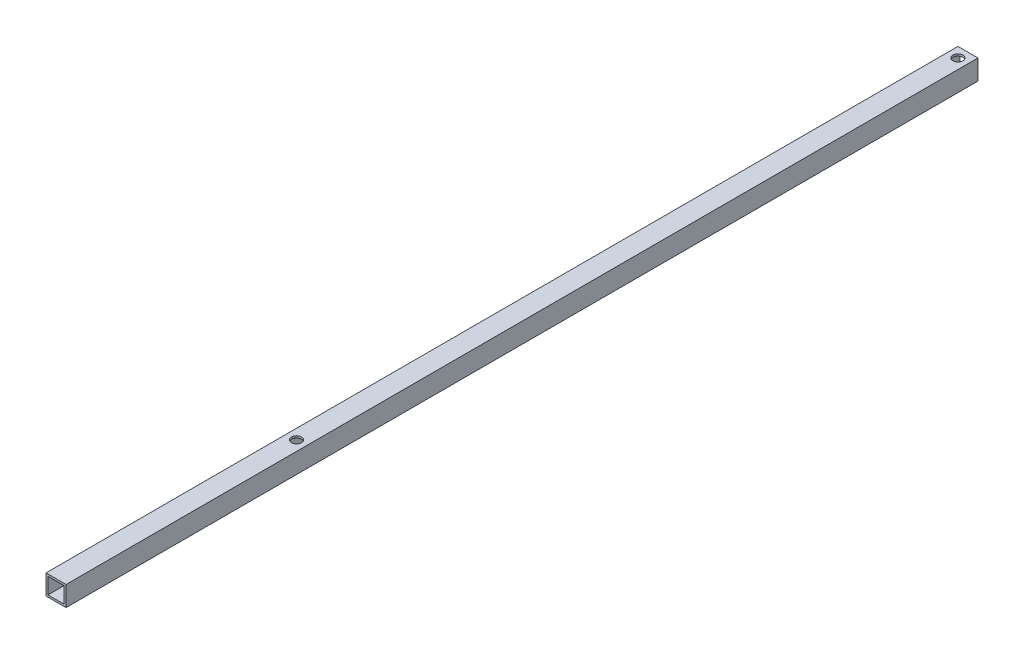
ISO-10303-21;
HEADER;
FILE_DESCRIPTION(('STEP AP214'),'2;1');
FILE_NAME('part.step','',(''),(''),'','','');
FILE_SCHEMA(('AUTOMOTIVE_DESIGN { 1 0 10303 214 1 1 1 1 }'));
ENDSEC;
DATA;
#1=APPLICATION_CONTEXT('core data for automotive mechanical design processes');
#2=APPLICATION_PROTOCOL_DEFINITION('international standard','automotive_design',2000,#1);
#3=PRODUCT_CONTEXT('',#1,'mechanical');
#4=PRODUCT('Part','Part','',(#3));
#5=PRODUCT_RELATED_PRODUCT_CATEGORY('part','',(#4));
#6=PRODUCT_DEFINITION_FORMATION('','',#4);
#7=PRODUCT_DEFINITION_CONTEXT('part definition',#1,'design');
#8=PRODUCT_DEFINITION('design','',#6,#7);
#9=PRODUCT_DEFINITION_SHAPE('','',#8);
#10=(LENGTH_UNIT() NAMED_UNIT(*) SI_UNIT(.MILLI.,.METRE.));
#11=(NAMED_UNIT(*) PLANE_ANGLE_UNIT() SI_UNIT($,.RADIAN.));
#12=(NAMED_UNIT(*) SI_UNIT($,.STERADIAN.) SOLID_ANGLE_UNIT());
#13=UNCERTAINTY_MEASURE_WITH_UNIT(LENGTH_MEASURE(1.E-05),#10,'distance_accuracy_value','');
#14=(GEOMETRIC_REPRESENTATION_CONTEXT(3) GLOBAL_UNCERTAINTY_ASSIGNED_CONTEXT((#13)) GLOBAL_UNIT_ASSIGNED_CONTEXT((#10,
#11,#12)) REPRESENTATION_CONTEXT('',''));
#15=CARTESIAN_POINT('',(0.,0.,0.));
#16=DIRECTION('',(0.,0.,1.));
#17=DIRECTION('',(1.,0.,0.));
#18=AXIS2_PLACEMENT_3D('',#15,#16,#17);
#19=CARTESIAN_POINT('',(0.,0.,1155.7));
#20=DIRECTION('',(0.,0.,-1.));
#21=DIRECTION('',(-1.,0.,0.));
#22=AXIS2_PLACEMENT_3D('',#19,#20,#21);
#23=PLANE('',#22);
#24=DIRECTION('',(0.,-1.,0.));
#25=VECTOR('',#24,1.);
#26=CARTESIAN_POINT('',(0.,0.,1155.7));
#27=LINE('',#26,#25);
#28=CARTESIAN_POINT('',(0.,25.4,1155.7));
#29=VERTEX_POINT('',#28);
#30=CARTESIAN_POINT('',(0.,0.,1155.7));
#31=VERTEX_POINT('',#30);
#32=EDGE_CURVE('E138',#29,#31,#27,.T.);
#33=ORIENTED_EDGE('',*,*,#32,.T.);
#34=DIRECTION('',(1.,0.,0.));
#35=VECTOR('',#34,1.);
#36=CARTESIAN_POINT('',(0.,0.,1155.7));
#37=LINE('',#36,#35);
#38=CARTESIAN_POINT('',(25.4,0.,1155.7));
#39=VERTEX_POINT('',#38);
#40=EDGE_CURVE('E141',#31,#39,#37,.T.);
#41=ORIENTED_EDGE('',*,*,#40,.T.);
#42=DIRECTION('',(0.,1.,0.));
#43=VECTOR('',#42,1.);
#44=CARTESIAN_POINT('',(25.4,0.,1155.7));
#45=LINE('',#44,#43);
#46=CARTESIAN_POINT('',(25.4,25.4,1155.7));
#47=VERTEX_POINT('',#46);
#48=EDGE_CURVE('E144',#39,#47,#45,.T.);
#49=ORIENTED_EDGE('',*,*,#48,.T.);
#50=DIRECTION('',(-1.,0.,0.));
#51=VECTOR('',#50,1.);
#52=CARTESIAN_POINT('',(0.,25.4,1155.7));
#53=LINE('',#52,#51);
#54=EDGE_CURVE('E146',#47,#29,#53,.T.);
#55=ORIENTED_EDGE('',*,*,#54,.T.);
#56=EDGE_LOOP('',(#33,#41,#49,#55));
#57=FACE_BOUND('',#56,.T.);
#58=DIRECTION('',(0.,-1.,0.));
#59=VECTOR('',#58,1.);
#60=CARTESIAN_POINT('',(2.54,2.54,1155.7));
#61=LINE('',#60,#59);
#62=CARTESIAN_POINT('',(2.54,22.86,1155.7));
#63=VERTEX_POINT('',#62);
#64=CARTESIAN_POINT('',(2.54,2.54,1155.7));
#65=VERTEX_POINT('',#64);
#66=EDGE_CURVE('E100',#63,#65,#61,.T.);
#67=ORIENTED_EDGE('',*,*,#66,.F.);
#68=DIRECTION('',(-1.,0.,0.));
#69=VECTOR('',#68,1.);
#70=CARTESIAN_POINT('',(2.54,22.86,1155.7));
#71=LINE('',#70,#69);
#72=CARTESIAN_POINT('',(22.86,22.86,1155.7));
#73=VERTEX_POINT('',#72);
#74=EDGE_CURVE('E122',#73,#63,#71,.T.);
#75=ORIENTED_EDGE('',*,*,#74,.F.);
#76=DIRECTION('',(0.,1.,0.));
#77=VECTOR('',#76,1.);
#78=CARTESIAN_POINT('',(22.86,2.54,1155.7));
#79=LINE('',#78,#77);
#80=CARTESIAN_POINT('',(22.86,2.54,1155.7));
#81=VERTEX_POINT('',#80);
#82=EDGE_CURVE('E120',#81,#73,#79,.T.);
#83=ORIENTED_EDGE('',*,*,#82,.F.);
#84=DIRECTION('',(1.,0.,0.));
#85=VECTOR('',#84,1.);
#86=CARTESIAN_POINT('',(2.54,2.54,1155.7));
#87=LINE('',#86,#85);
#88=EDGE_CURVE('E108',#65,#81,#87,.T.);
#89=ORIENTED_EDGE('',*,*,#88,.F.);
#90=EDGE_LOOP('',(#67,#75,#83,#89));
#91=FACE_BOUND('',#90,.T.);
#92=ADVANCED_FACE('F33',(#57,#91),#23,.F.);
#93=CARTESIAN_POINT('',(0.,0.,0.));
#94=DIRECTION('',(0.,0.,-1.));
#95=DIRECTION('',(-1.,0.,0.));
#96=AXIS2_PLACEMENT_3D('',#93,#94,#95);
#97=PLANE('',#96);
#98=DIRECTION('',(0.,-1.,0.));
#99=VECTOR('',#98,1.);
#100=CARTESIAN_POINT('',(0.,0.,0.));
#101=LINE('',#100,#99);
#102=CARTESIAN_POINT('',(0.,25.4,0.));
#103=VERTEX_POINT('',#102);
#104=CARTESIAN_POINT('',(0.,0.,0.));
#105=VERTEX_POINT('',#104);
#106=EDGE_CURVE('E116',#103,#105,#101,.T.);
#107=ORIENTED_EDGE('',*,*,#106,.F.);
#108=DIRECTION('',(-1.,0.,0.));
#109=VECTOR('',#108,1.);
#110=CARTESIAN_POINT('',(0.,25.4,0.));
#111=LINE('',#110,#109);
#112=CARTESIAN_POINT('',(25.4,25.4,0.));
#113=VERTEX_POINT('',#112);
#114=EDGE_CURVE('E142',#113,#103,#111,.T.);
#115=ORIENTED_EDGE('',*,*,#114,.F.);
#116=DIRECTION('',(0.,1.,0.));
#117=VECTOR('',#116,1.);
#118=CARTESIAN_POINT('',(25.4,0.,0.));
#119=LINE('',#118,#117);
#120=CARTESIAN_POINT('',(25.4,0.,0.));
#121=VERTEX_POINT('',#120);
#122=EDGE_CURVE('E153',#121,#113,#119,.T.);
#123=ORIENTED_EDGE('',*,*,#122,.F.);
#124=DIRECTION('',(1.,0.,0.));
#125=VECTOR('',#124,1.);
#126=CARTESIAN_POINT('',(0.,0.,0.));
#127=LINE('',#126,#125);
#128=EDGE_CURVE('E151',#105,#121,#127,.T.);
#129=ORIENTED_EDGE('',*,*,#128,.F.);
#130=EDGE_LOOP('',(#107,#115,#123,#129));
#131=FACE_BOUND('',#130,.T.);
#132=DIRECTION('',(-1.,0.,0.));
#133=VECTOR('',#132,1.);
#134=CARTESIAN_POINT('',(2.54,22.86,0.));
#135=LINE('',#134,#133);
#136=CARTESIAN_POINT('',(22.86,22.86,0.));
#137=VERTEX_POINT('',#136);
#138=CARTESIAN_POINT('',(2.54,22.86,0.));
#139=VERTEX_POINT('',#138);
#140=EDGE_CURVE('E109',#137,#139,#135,.T.);
#141=ORIENTED_EDGE('',*,*,#140,.T.);
#142=DIRECTION('',(0.,-1.,0.));
#143=VECTOR('',#142,1.);
#144=CARTESIAN_POINT('',(2.54,2.54,0.));
#145=LINE('',#144,#143);
#146=CARTESIAN_POINT('',(2.54,2.54,0.));
#147=VERTEX_POINT('',#146);
#148=EDGE_CURVE('E58',#139,#147,#145,.T.);
#149=ORIENTED_EDGE('',*,*,#148,.T.);
#150=DIRECTION('',(1.,0.,0.));
#151=VECTOR('',#150,1.);
#152=CARTESIAN_POINT('',(2.54,2.54,0.));
#153=LINE('',#152,#151);
#154=CARTESIAN_POINT('',(22.86,2.54,0.));
#155=VERTEX_POINT('',#154);
#156=EDGE_CURVE('E115',#147,#155,#153,.T.);
#157=ORIENTED_EDGE('',*,*,#156,.T.);
#158=DIRECTION('',(0.,1.,0.));
#159=VECTOR('',#158,1.);
#160=CARTESIAN_POINT('',(22.86,2.54,0.));
#161=LINE('',#160,#159);
#162=EDGE_CURVE('E130',#155,#137,#161,.T.);
#163=ORIENTED_EDGE('',*,*,#162,.T.);
#164=EDGE_LOOP('',(#141,#149,#157,#163));
#165=FACE_BOUND('',#164,.T.);
#166=ADVANCED_FACE('F200',(#131,#165),#97,.T.);
#167=CARTESIAN_POINT('',(0.,0.,1155.7));
#168=DIRECTION('',(1.,0.,0.));
#169=DIRECTION('',(0.,1.,0.));
#170=AXIS2_PLACEMENT_3D('',#167,#168,#169);
#171=PLANE('',#170);
#172=ORIENTED_EDGE('',*,*,#106,.T.);
#173=DIRECTION('',(0.,0.,-1.));
#174=VECTOR('',#173,1.);
#175=CARTESIAN_POINT('',(0.,0.,1155.7));
#176=LINE('',#175,#174);
#177=EDGE_CURVE('E11',#31,#105,#176,.T.);
#178=ORIENTED_EDGE('',*,*,#177,.F.);
#179=ORIENTED_EDGE('',*,*,#32,.F.);
#180=DIRECTION('',(0.,0.,-1.));
#181=VECTOR('',#180,1.);
#182=CARTESIAN_POINT('',(0.,25.4,1155.7));
#183=LINE('',#182,#181);
#184=EDGE_CURVE('E148',#29,#103,#183,.T.);
#185=ORIENTED_EDGE('',*,*,#184,.T.);
#186=EDGE_LOOP('',(#172,#178,#179,#185));
#187=FACE_BOUND('',#186,.T.);
#188=ADVANCED_FACE('F35',(#187),#171,.F.);
#189=CARTESIAN_POINT('',(0.,0.,1155.7));
#190=DIRECTION('',(0.,1.,0.));
#191=DIRECTION('',(0.,0.,1.));
#192=AXIS2_PLACEMENT_3D('',#189,#190,#191);
#193=PLANE('',#192);
#194=CARTESIAN_POINT('',(12.7,0.,850.9));
#195=DIRECTION('',(0.,1.,0.));
#196=DIRECTION('',(0.,0.,1.));
#197=AXIS2_PLACEMENT_3D('',#194,#195,#196);
#198=CIRCLE('',#197,6.35);
#199=CARTESIAN_POINT('',(12.7,0.,857.25));
#200=VERTEX_POINT('',#199);
#201=EDGE_CURVE('E174',#200,#200,#198,.T.);
#202=ORIENTED_EDGE('',*,*,#201,.T.);
#203=EDGE_LOOP('',(#202));
#204=FACE_BOUND('',#203,.T.);
#205=CARTESIAN_POINT('',(12.7,0.,12.7));
#206=DIRECTION('',(0.,-1.,0.));
#207=DIRECTION('',(0.,0.,-1.));
#208=AXIS2_PLACEMENT_3D('',#205,#206,#207);
#209=CIRCLE('',#208,6.35);
#210=CARTESIAN_POINT('',(12.7,0.,6.35));
#211=VERTEX_POINT('',#210);
#212=EDGE_CURVE('E169',#211,#211,#209,.T.);
#213=ORIENTED_EDGE('',*,*,#212,.F.);
#214=EDGE_LOOP('',(#213));
#215=FACE_BOUND('',#214,.T.);
#216=ORIENTED_EDGE('',*,*,#128,.T.);
#217=DIRECTION('',(0.,0.,-1.));
#218=VECTOR('',#217,1.);
#219=CARTESIAN_POINT('',(25.4,0.,1155.7));
#220=LINE('',#219,#218);
#221=EDGE_CURVE('E42',#39,#121,#220,.T.);
#222=ORIENTED_EDGE('',*,*,#221,.F.);
#223=ORIENTED_EDGE('',*,*,#40,.F.);
#224=ORIENTED_EDGE('',*,*,#177,.T.);
#225=EDGE_LOOP('',(#216,#222,#223,#224));
#226=FACE_BOUND('',#225,.T.);
#227=ADVANCED_FACE('F224',(#204,#215,#226),#193,.F.);
#228=CARTESIAN_POINT('',(25.4,0.,1155.7));
#229=DIRECTION('',(-1.,0.,0.));
#230=DIRECTION('',(0.,-1.,0.));
#231=AXIS2_PLACEMENT_3D('',#228,#229,#230);
#232=PLANE('',#231);
#233=ORIENTED_EDGE('',*,*,#122,.T.);
#234=DIRECTION('',(0.,0.,-1.));
#235=VECTOR('',#234,1.);
#236=CARTESIAN_POINT('',(25.4,25.4,1155.7));
#237=LINE('',#236,#235);
#238=EDGE_CURVE('E158',#47,#113,#237,.T.);
#239=ORIENTED_EDGE('',*,*,#238,.F.);
#240=ORIENTED_EDGE('',*,*,#48,.F.);
#241=ORIENTED_EDGE('',*,*,#221,.T.);
#242=EDGE_LOOP('',(#233,#239,#240,#241));
#243=FACE_BOUND('',#242,.T.);
#244=ADVANCED_FACE('F222',(#243),#232,.F.);
#245=CARTESIAN_POINT('',(0.,25.4,1155.7));
#246=DIRECTION('',(0.,-1.,0.));
#247=DIRECTION('',(0.,0.,-1.));
#248=AXIS2_PLACEMENT_3D('',#245,#246,#247);
#249=PLANE('',#248);
#250=CARTESIAN_POINT('',(12.7,25.4,850.9));
#251=DIRECTION('',(0.,-1.,0.));
#252=DIRECTION('',(0.,0.,-1.));
#253=AXIS2_PLACEMENT_3D('',#250,#251,#252);
#254=CIRCLE('',#253,6.35);
#255=CARTESIAN_POINT('',(12.7,25.4,844.55));
#256=VERTEX_POINT('',#255);
#257=EDGE_CURVE('E182',#256,#256,#254,.T.);
#258=ORIENTED_EDGE('',*,*,#257,.T.);
#259=EDGE_LOOP('',(#258));
#260=FACE_BOUND('',#259,.T.);
#261=CARTESIAN_POINT('',(12.7,25.4,12.7));
#262=DIRECTION('',(0.,-1.,0.));
#263=DIRECTION('',(0.,0.,-1.));
#264=AXIS2_PLACEMENT_3D('',#261,#262,#263);
#265=CIRCLE('',#264,6.35);
#266=CARTESIAN_POINT('',(12.7,25.4,6.35));
#267=VERTEX_POINT('',#266);
#268=EDGE_CURVE('E164',#267,#267,#265,.T.);
#269=ORIENTED_EDGE('',*,*,#268,.T.);
#270=EDGE_LOOP('',(#269));
#271=FACE_BOUND('',#270,.T.);
#272=ORIENTED_EDGE('',*,*,#114,.T.);
#273=ORIENTED_EDGE('',*,*,#184,.F.);
#274=ORIENTED_EDGE('',*,*,#54,.F.);
#275=ORIENTED_EDGE('',*,*,#238,.T.);
#276=EDGE_LOOP('',(#272,#273,#274,#275));
#277=FACE_BOUND('',#276,.T.);
#278=ADVANCED_FACE('F219',(#260,#271,#277),#249,.F.);
#279=CARTESIAN_POINT('',(2.54,2.54,1155.7));
#280=DIRECTION('',(1.,0.,0.));
#281=DIRECTION('',(0.,0.,-1.));
#282=AXIS2_PLACEMENT_3D('',#279,#280,#281);
#283=PLANE('',#282);
#284=ORIENTED_EDGE('',*,*,#148,.F.);
#285=DIRECTION('',(0.,0.,-1.));
#286=VECTOR('',#285,1.);
#287=CARTESIAN_POINT('',(2.54,22.86,1155.7));
#288=LINE('',#287,#286);
#289=EDGE_CURVE('E104',#63,#139,#288,.T.);
#290=ORIENTED_EDGE('',*,*,#289,.F.);
#291=ORIENTED_EDGE('',*,*,#66,.T.);
#292=DIRECTION('',(0.,0.,-1.));
#293=VECTOR('',#292,1.);
#294=CARTESIAN_POINT('',(2.54,2.54,1155.7));
#295=LINE('',#294,#293);
#296=EDGE_CURVE('E103',#65,#147,#295,.T.);
#297=ORIENTED_EDGE('',*,*,#296,.T.);
#298=EDGE_LOOP('',(#284,#290,#291,#297));
#299=FACE_BOUND('',#298,.T.);
#300=ADVANCED_FACE('F102',(#299),#283,.T.);
#301=CARTESIAN_POINT('',(2.54,2.54,1155.7));
#302=DIRECTION('',(0.,1.,0.));
#303=DIRECTION('',(0.,0.,1.));
#304=AXIS2_PLACEMENT_3D('',#301,#302,#303);
#305=PLANE('',#304);
#306=CARTESIAN_POINT('',(12.7,2.54,850.9));
#307=DIRECTION('',(0.,1.,0.));
#308=DIRECTION('',(0.,0.,1.));
#309=AXIS2_PLACEMENT_3D('',#306,#307,#308);
#310=CIRCLE('',#309,6.35);
#311=CARTESIAN_POINT('',(12.7,2.54,857.25));
#312=VERTEX_POINT('',#311);
#313=EDGE_CURVE('E179',#312,#312,#310,.T.);
#314=ORIENTED_EDGE('',*,*,#313,.F.);
#315=EDGE_LOOP('',(#314));
#316=FACE_BOUND('',#315,.T.);
#317=CARTESIAN_POINT('',(12.7,2.54,12.7));
#318=DIRECTION('',(0.,1.,0.));
#319=DIRECTION('',(0.,0.,1.));
#320=AXIS2_PLACEMENT_3D('',#317,#318,#319);
#321=CIRCLE('',#320,6.35);
#322=CARTESIAN_POINT('',(12.7,2.54,19.05));
#323=VERTEX_POINT('',#322);
#324=EDGE_CURVE('E128',#323,#323,#321,.T.);
#325=ORIENTED_EDGE('',*,*,#324,.F.);
#326=EDGE_LOOP('',(#325));
#327=FACE_BOUND('',#326,.T.);
#328=ORIENTED_EDGE('',*,*,#156,.F.);
#329=ORIENTED_EDGE('',*,*,#296,.F.);
#330=ORIENTED_EDGE('',*,*,#88,.T.);
#331=DIRECTION('',(0.,0.,-1.));
#332=VECTOR('',#331,1.);
#333=CARTESIAN_POINT('',(22.86,2.54,1155.7));
#334=LINE('',#333,#332);
#335=EDGE_CURVE('E117',#81,#155,#334,.T.);
#336=ORIENTED_EDGE('',*,*,#335,.T.);
#337=EDGE_LOOP('',(#328,#329,#330,#336));
#338=FACE_BOUND('',#337,.T.);
#339=ADVANCED_FACE('F112',(#316,#327,#338),#305,.T.);
#340=CARTESIAN_POINT('',(22.86,2.54,1155.7));
#341=DIRECTION('',(-1.,0.,0.));
#342=DIRECTION('',(0.,-1.,0.));
#343=AXIS2_PLACEMENT_3D('',#340,#341,#342);
#344=PLANE('',#343);
#345=ORIENTED_EDGE('',*,*,#162,.F.);
#346=ORIENTED_EDGE('',*,*,#335,.F.);
#347=ORIENTED_EDGE('',*,*,#82,.T.);
#348=DIRECTION('',(0.,0.,-1.));
#349=VECTOR('',#348,1.);
#350=CARTESIAN_POINT('',(22.86,22.86,1155.7));
#351=LINE('',#350,#349);
#352=EDGE_CURVE('E50',#73,#137,#351,.T.);
#353=ORIENTED_EDGE('',*,*,#352,.T.);
#354=EDGE_LOOP('',(#345,#346,#347,#353));
#355=FACE_BOUND('',#354,.T.);
#356=ADVANCED_FACE('F196',(#355),#344,.T.);
#357=CARTESIAN_POINT('',(2.54,22.86,1155.7));
#358=DIRECTION('',(0.,-1.,0.));
#359=DIRECTION('',(0.,0.,-1.));
#360=AXIS2_PLACEMENT_3D('',#357,#358,#359);
#361=PLANE('',#360);
#362=CARTESIAN_POINT('',(12.7,22.86,850.9));
#363=DIRECTION('',(0.,-1.,0.));
#364=DIRECTION('',(0.,0.,-1.));
#365=AXIS2_PLACEMENT_3D('',#362,#363,#364);
#366=CIRCLE('',#365,6.35);
#367=CARTESIAN_POINT('',(12.7,22.86,844.55));
#368=VERTEX_POINT('',#367);
#369=EDGE_CURVE('E37',#368,#368,#366,.T.);
#370=ORIENTED_EDGE('',*,*,#369,.F.);
#371=EDGE_LOOP('',(#370));
#372=FACE_BOUND('',#371,.T.);
#373=CARTESIAN_POINT('',(12.7,22.86,12.7));
#374=DIRECTION('',(0.,-1.,0.));
#375=DIRECTION('',(0.,0.,-1.));
#376=AXIS2_PLACEMENT_3D('',#373,#374,#375);
#377=CIRCLE('',#376,6.35);
#378=CARTESIAN_POINT('',(12.7,22.86,6.35));
#379=VERTEX_POINT('',#378);
#380=EDGE_CURVE('E162',#379,#379,#377,.T.);
#381=ORIENTED_EDGE('',*,*,#380,.F.);
#382=EDGE_LOOP('',(#381));
#383=FACE_BOUND('',#382,.T.);
#384=ORIENTED_EDGE('',*,*,#140,.F.);
#385=ORIENTED_EDGE('',*,*,#352,.F.);
#386=ORIENTED_EDGE('',*,*,#74,.T.);
#387=ORIENTED_EDGE('',*,*,#289,.T.);
#388=EDGE_LOOP('',(#384,#385,#386,#387));
#389=FACE_BOUND('',#388,.T.);
#390=ADVANCED_FACE('F192',(#372,#383,#389),#361,.T.);
#391=CARTESIAN_POINT('',(12.7,25.4,12.7));
#392=DIRECTION('',(0.,-1.,0.));
#393=DIRECTION('',(0.,0.,-1.));
#394=AXIS2_PLACEMENT_3D('',#391,#392,#393);
#395=CYLINDRICAL_SURFACE('',#394,6.35);
#396=ORIENTED_EDGE('',*,*,#380,.T.);
#397=EDGE_LOOP('',(#396));
#398=FACE_BOUND('',#397,.T.);
#399=ORIENTED_EDGE('',*,*,#268,.F.);
#400=EDGE_LOOP('',(#399));
#401=FACE_BOUND('',#400,.T.);
#402=ADVANCED_FACE('F195',(#398,#401),#395,.F.);
#403=ORIENTED_EDGE('',*,*,#324,.T.);
#404=EDGE_LOOP('',(#403));
#405=FACE_BOUND('',#404,.T.);
#406=ORIENTED_EDGE('',*,*,#212,.T.);
#407=EDGE_LOOP('',(#406));
#408=FACE_BOUND('',#407,.T.);
#409=ADVANCED_FACE('F248',(#405,#408),#395,.F.);
#410=CARTESIAN_POINT('',(12.7,25.4,850.9));
#411=DIRECTION('',(0.,-1.,0.));
#412=DIRECTION('',(0.,0.,-1.));
#413=AXIS2_PLACEMENT_3D('',#410,#411,#412);
#414=CYLINDRICAL_SURFACE('',#413,6.35);
#415=ORIENTED_EDGE('',*,*,#369,.T.);
#416=EDGE_LOOP('',(#415));
#417=FACE_BOUND('',#416,.T.);
#418=ORIENTED_EDGE('',*,*,#257,.F.);
#419=EDGE_LOOP('',(#418));
#420=FACE_BOUND('',#419,.T.);
#421=ADVANCED_FACE('F189',(#417,#420),#414,.F.);
#422=ORIENTED_EDGE('',*,*,#313,.T.);
#423=EDGE_LOOP('',(#422));
#424=FACE_BOUND('',#423,.T.);
#425=ORIENTED_EDGE('',*,*,#201,.F.);
#426=EDGE_LOOP('',(#425));
#427=FACE_BOUND('',#426,.T.);
#428=ADVANCED_FACE('F256',(#424,#427),#414,.F.);
#429=CLOSED_SHELL('',(#92,#166,#188,#227,#244,#278,#300,#339,#356,#390,#402,#409,#421,#428));
#430=MANIFOLD_SOLID_BREP('B2',#429);
#431=ADVANCED_BREP_SHAPE_REPRESENTATION('',(#18,#430),#14);
#432=SHAPE_DEFINITION_REPRESENTATION(#9,#431);
ENDSEC;
END-ISO-10303-21;
